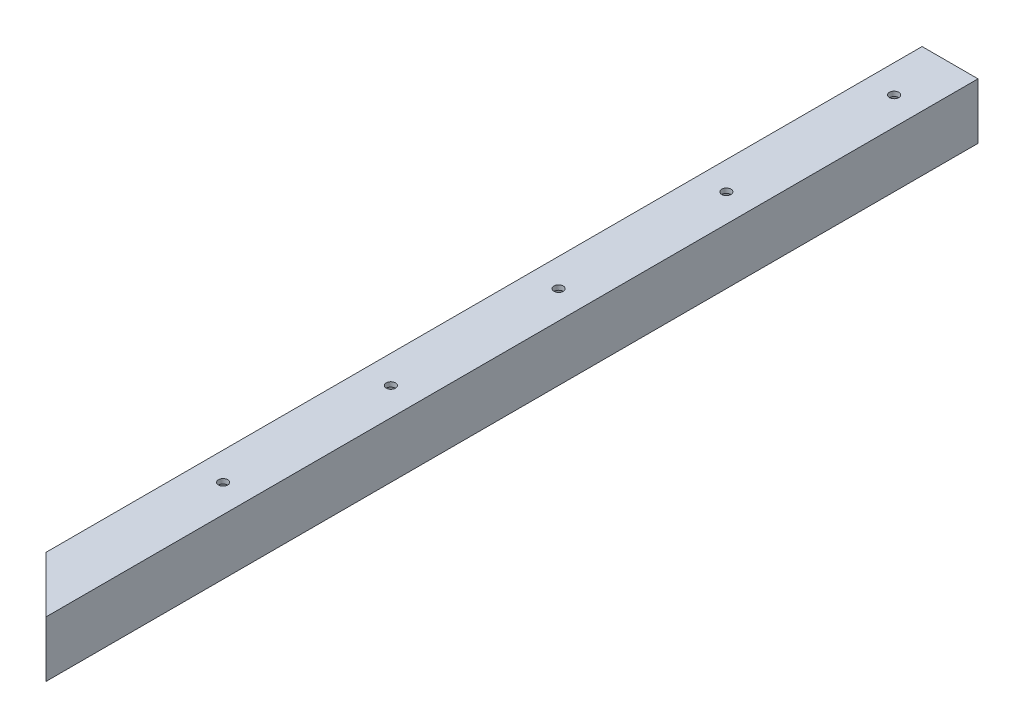
ISO-10303-21;
HEADER;
FILE_DESCRIPTION(('STEP AP214'),'2;1');
FILE_NAME('part.step','',(''),(''),'','','');
FILE_SCHEMA(('AUTOMOTIVE_DESIGN { 1 0 10303 214 1 1 1 1 }'));
ENDSEC;
DATA;
#1=APPLICATION_CONTEXT('core data for automotive mechanical design processes');
#2=APPLICATION_PROTOCOL_DEFINITION('international standard','automotive_design',2000,#1);
#3=PRODUCT_CONTEXT('',#1,'mechanical');
#4=PRODUCT('Part','Part','',(#3));
#5=PRODUCT_RELATED_PRODUCT_CATEGORY('part','',(#4));
#6=PRODUCT_DEFINITION_FORMATION('','',#4);
#7=PRODUCT_DEFINITION_CONTEXT('part definition',#1,'design');
#8=PRODUCT_DEFINITION('design','',#6,#7);
#9=PRODUCT_DEFINITION_SHAPE('','',#8);
#10=(LENGTH_UNIT() NAMED_UNIT(*) SI_UNIT(.MILLI.,.METRE.));
#11=(NAMED_UNIT(*) PLANE_ANGLE_UNIT() SI_UNIT($,.RADIAN.));
#12=(NAMED_UNIT(*) SI_UNIT($,.STERADIAN.) SOLID_ANGLE_UNIT());
#13=UNCERTAINTY_MEASURE_WITH_UNIT(LENGTH_MEASURE(1.E-05),#10,'distance_accuracy_value','');
#14=(GEOMETRIC_REPRESENTATION_CONTEXT(3) GLOBAL_UNCERTAINTY_ASSIGNED_CONTEXT((#13)) GLOBAL_UNIT_ASSIGNED_CONTEXT((#10,
#11,#12)) REPRESENTATION_CONTEXT('',''));
#15=CARTESIAN_POINT('',(0.,0.,0.));
#16=DIRECTION('',(0.,0.,1.));
#17=DIRECTION('',(1.,0.,0.));
#18=AXIS2_PLACEMENT_3D('',#15,#16,#17);
#19=CARTESIAN_POINT('',(19.05,-0.00100000000000211,368.3));
#20=DIRECTION('',(0.707106781176342,0.,-0.707106781196753));
#21=DIRECTION('',(-0.707106781196753,0.,-0.707106781176342));
#22=AXIS2_PLACEMENT_3D('',#19,#20,#21);
#23=PLANE('',#22);
#24=DIRECTION('',(0.,-1.,0.));
#25=VECTOR('',#24,1.);
#26=CARTESIAN_POINT('',(19.05,-0.000500000000001055,368.3));
#27=LINE('',#26,#25);
#28=CARTESIAN_POINT('',(19.05,38.1,368.3));
#29=VERTEX_POINT('',#28);
#30=CARTESIAN_POINT('',(19.05,0.,368.3));
#31=VERTEX_POINT('',#30);
#32=EDGE_CURVE('E51',#29,#31,#27,.T.);
#33=ORIENTED_EDGE('',*,*,#32,.F.);
#34=DIRECTION('',(0.707106781196753,0.,0.707106781176342));
#35=VECTOR('',#34,1.);
#36=CARTESIAN_POINT('',(-77.7875000001375,38.1,271.462500002658));
#37=LINE('',#36,#35);
#38=CARTESIAN_POINT('',(-19.05,38.1,330.2000000011));
#39=VERTEX_POINT('',#38);
#40=EDGE_CURVE('E170',#39,#29,#37,.T.);
#41=ORIENTED_EDGE('',*,*,#40,.F.);
#42=DIRECTION('',(0.,1.,0.));
#43=VECTOR('',#42,1.);
#44=CARTESIAN_POINT('',(-19.05,-0.000500000000001055,330.2000000011));
#45=LINE('',#44,#43);
#46=CARTESIAN_POINT('',(-19.05,0.,330.2000000011));
#47=VERTEX_POINT('',#46);
#48=EDGE_CURVE('E11',#47,#39,#45,.T.);
#49=ORIENTED_EDGE('',*,*,#48,.F.);
#50=DIRECTION('',(-0.707106781196753,0.,-0.707106781176342));
#51=VECTOR('',#50,1.);
#52=CARTESIAN_POINT('',(-77.7875000001375,0.,271.462500002658));
#53=LINE('',#52,#51);
#54=EDGE_CURVE('E104',#31,#47,#53,.T.);
#55=ORIENTED_EDGE('',*,*,#54,.F.);
#56=EDGE_LOOP('',(#33,#41,#49,#55));
#57=FACE_BOUND('',#56,.T.);
#58=DIRECTION('',(0.707106781196753,0.,0.707106781176342));
#59=VECTOR('',#58,1.);
#60=CARTESIAN_POINT('',(-77.7875000001375,3.175,271.462500002658));
#61=LINE('',#60,#59);
#62=CARTESIAN_POINT('',(-15.875,3.175,333.375000001008));
#63=VERTEX_POINT('',#62);
#64=CARTESIAN_POINT('',(15.875,3.175,365.125000000092));
#65=VERTEX_POINT('',#64);
#66=EDGE_CURVE('E126',#63,#65,#61,.T.);
#67=ORIENTED_EDGE('',*,*,#66,.F.);
#68=DIRECTION('',(0.,-1.,0.));
#69=VECTOR('',#68,1.);
#70=CARTESIAN_POINT('',(-15.875,-0.000500000000001055,333.375000001008));
#71=LINE('',#70,#69);
#72=CARTESIAN_POINT('',(-15.875,34.925,333.375000001008));
#73=VERTEX_POINT('',#72);
#74=EDGE_CURVE('E73',#73,#63,#71,.T.);
#75=ORIENTED_EDGE('',*,*,#74,.F.);
#76=DIRECTION('',(-0.707106781196753,0.,-0.707106781176342));
#77=VECTOR('',#76,1.);
#78=CARTESIAN_POINT('',(-77.7875000001375,34.925,271.462500002658));
#79=LINE('',#78,#77);
#80=CARTESIAN_POINT('',(15.875,34.925,365.125000000092));
#81=VERTEX_POINT('',#80);
#82=EDGE_CURVE('E91',#81,#73,#79,.T.);
#83=ORIENTED_EDGE('',*,*,#82,.F.);
#84=DIRECTION('',(0.,1.,0.));
#85=VECTOR('',#84,1.);
#86=CARTESIAN_POINT('',(15.875,-0.000500000000001055,365.125000000092));
#87=LINE('',#86,#85);
#88=EDGE_CURVE('E79',#65,#81,#87,.T.);
#89=ORIENTED_EDGE('',*,*,#88,.F.);
#90=EDGE_LOOP('',(#67,#75,#83,#89));
#91=FACE_BOUND('',#90,.T.);
#92=ADVANCED_FACE('F32',(#57,#91),#23,.F.);
#93=CARTESIAN_POINT('',(-19.05,0.,-241.3));
#94=DIRECTION('',(-1.,0.,0.));
#95=DIRECTION('',(0.,0.,1.));
#96=AXIS2_PLACEMENT_3D('',#93,#94,#95);
#97=PLANE('',#96);
#98=ORIENTED_EDGE('',*,*,#48,.T.);
#99=DIRECTION('',(0.,0.,1.));
#100=VECTOR('',#99,1.);
#101=CARTESIAN_POINT('',(-19.05,38.1,241.3));
#102=LINE('',#101,#100);
#103=CARTESIAN_POINT('',(-19.05,38.1,-266.7));
#104=VERTEX_POINT('',#103);
#105=EDGE_CURVE('E95',#104,#39,#102,.T.);
#106=ORIENTED_EDGE('',*,*,#105,.F.);
#107=DIRECTION('',(0.,1.,0.));
#108=VECTOR('',#107,1.);
#109=CARTESIAN_POINT('',(-19.05,0.,-266.7));
#110=LINE('',#109,#108);
#111=CARTESIAN_POINT('',(-19.05,0.,-266.7));
#112=VERTEX_POINT('',#111);
#113=EDGE_CURVE('E383',#112,#104,#110,.T.);
#114=ORIENTED_EDGE('',*,*,#113,.F.);
#115=DIRECTION('',(0.,0.,-1.));
#116=VECTOR('',#115,1.);
#117=CARTESIAN_POINT('',(-19.05,0.,241.3));
#118=LINE('',#117,#116);
#119=EDGE_CURVE('E145',#47,#112,#118,.T.);
#120=ORIENTED_EDGE('',*,*,#119,.F.);
#121=EDGE_LOOP('',(#98,#106,#114,#120));
#122=FACE_BOUND('',#121,.T.);
#123=ADVANCED_FACE('F215',(#122),#97,.T.);
#124=CARTESIAN_POINT('',(0.,38.1,0.));
#125=DIRECTION('',(0.,1.,0.));
#126=DIRECTION('',(0.,0.,1.));
#127=AXIS2_PLACEMENT_3D('',#124,#125,#126);
#128=PLANE('',#127);
#129=CARTESIAN_POINT('',(0.,38.1,-228.6));
#130=DIRECTION('',(0.,-1.,0.));
#131=DIRECTION('',(0.,0.,-1.));
#132=AXIS2_PLACEMENT_3D('',#129,#130,#131);
#133=CIRCLE('',#132,3.175);
#134=CARTESIAN_POINT('',(0.,38.1,-231.775));
#135=VERTEX_POINT('',#134);
#136=EDGE_CURVE('E42',#135,#135,#133,.T.);
#137=ORIENTED_EDGE('',*,*,#136,.T.);
#138=EDGE_LOOP('',(#137));
#139=FACE_BOUND('',#138,.T.);
#140=CARTESIAN_POINT('',(0.,38.1,-114.3));
#141=DIRECTION('',(0.,-1.,0.));
#142=DIRECTION('',(0.,0.,-1.));
#143=AXIS2_PLACEMENT_3D('',#140,#141,#142);
#144=CIRCLE('',#143,3.175);
#145=CARTESIAN_POINT('',(0.,38.1,-117.475));
#146=VERTEX_POINT('',#145);
#147=EDGE_CURVE('E182',#146,#146,#144,.T.);
#148=ORIENTED_EDGE('',*,*,#147,.T.);
#149=EDGE_LOOP('',(#148));
#150=FACE_BOUND('',#149,.T.);
#151=CARTESIAN_POINT('',(0.,38.1,0.));
#152=DIRECTION('',(0.,-1.,0.));
#153=DIRECTION('',(0.,0.,-1.));
#154=AXIS2_PLACEMENT_3D('',#151,#152,#153);
#155=CIRCLE('',#154,3.175);
#156=CARTESIAN_POINT('',(0.,38.1,-3.175));
#157=VERTEX_POINT('',#156);
#158=EDGE_CURVE('E185',#157,#157,#155,.T.);
#159=ORIENTED_EDGE('',*,*,#158,.T.);
#160=EDGE_LOOP('',(#159));
#161=FACE_BOUND('',#160,.T.);
#162=CARTESIAN_POINT('',(0.,38.1,114.3));
#163=DIRECTION('',(0.,-1.,0.));
#164=DIRECTION('',(0.,0.,-1.));
#165=AXIS2_PLACEMENT_3D('',#162,#163,#164);
#166=CIRCLE('',#165,3.175);
#167=CARTESIAN_POINT('',(0.,38.1,111.125));
#168=VERTEX_POINT('',#167);
#169=EDGE_CURVE('E188',#168,#168,#166,.T.);
#170=ORIENTED_EDGE('',*,*,#169,.T.);
#171=EDGE_LOOP('',(#170));
#172=FACE_BOUND('',#171,.T.);
#173=CARTESIAN_POINT('',(0.,38.1,228.6));
#174=DIRECTION('',(0.,-1.,0.));
#175=DIRECTION('',(0.,0.,-1.));
#176=AXIS2_PLACEMENT_3D('',#173,#174,#175);
#177=CIRCLE('',#176,3.175);
#178=CARTESIAN_POINT('',(0.,38.1,225.425));
#179=VERTEX_POINT('',#178);
#180=EDGE_CURVE('E171',#179,#179,#177,.T.);
#181=ORIENTED_EDGE('',*,*,#180,.T.);
#182=EDGE_LOOP('',(#181));
#183=FACE_BOUND('',#182,.T.);
#184=ORIENTED_EDGE('',*,*,#40,.T.);
#185=DIRECTION('',(0.,0.,1.));
#186=VECTOR('',#185,1.);
#187=CARTESIAN_POINT('',(19.05,38.1,241.3));
#188=LINE('',#187,#186);
#189=CARTESIAN_POINT('',(19.05,38.1,-266.7));
#190=VERTEX_POINT('',#189);
#191=EDGE_CURVE('E161',#190,#29,#188,.T.);
#192=ORIENTED_EDGE('',*,*,#191,.F.);
#193=DIRECTION('',(1.,0.,0.));
#194=VECTOR('',#193,1.);
#195=CARTESIAN_POINT('',(-19.05,38.1,-266.7));
#196=LINE('',#195,#194);
#197=EDGE_CURVE('E166',#104,#190,#196,.T.);
#198=ORIENTED_EDGE('',*,*,#197,.F.);
#199=ORIENTED_EDGE('',*,*,#105,.T.);
#200=EDGE_LOOP('',(#184,#192,#198,#199));
#201=FACE_BOUND('',#200,.T.);
#202=ADVANCED_FACE('F194',(#139,#150,#161,#172,#183,#201),#128,.T.);
#203=CARTESIAN_POINT('',(0.,34.925,0.));
#204=DIRECTION('',(0.,1.,0.));
#205=DIRECTION('',(0.,0.,1.));
#206=AXIS2_PLACEMENT_3D('',#203,#204,#205);
#207=PLANE('',#206);
#208=ORIENTED_EDGE('',*,*,#82,.T.);
#209=DIRECTION('',(0.,0.,1.));
#210=VECTOR('',#209,1.);
#211=CARTESIAN_POINT('',(-15.875,34.925,-120.65));
#212=LINE('',#211,#210);
#213=CARTESIAN_POINT('',(-15.875,34.925,-266.7));
#214=VERTEX_POINT('',#213);
#215=EDGE_CURVE('E108',#214,#73,#212,.T.);
#216=ORIENTED_EDGE('',*,*,#215,.F.);
#217=DIRECTION('',(1.,0.,0.));
#218=VECTOR('',#217,1.);
#219=CARTESIAN_POINT('',(15.875,34.925,-266.7));
#220=LINE('',#219,#218);
#221=CARTESIAN_POINT('',(15.875,34.925,-266.7));
#222=VERTEX_POINT('',#221);
#223=EDGE_CURVE('E101',#214,#222,#220,.T.);
#224=ORIENTED_EDGE('',*,*,#223,.T.);
#225=DIRECTION('',(0.,0.,-1.));
#226=VECTOR('',#225,1.);
#227=CARTESIAN_POINT('',(15.875,34.925,120.65));
#228=LINE('',#227,#226);
#229=EDGE_CURVE('E84',#81,#222,#228,.T.);
#230=ORIENTED_EDGE('',*,*,#229,.F.);
#231=EDGE_LOOP('',(#208,#216,#224,#230));
#232=FACE_BOUND('',#231,.T.);
#233=CARTESIAN_POINT('',(0.,34.925,228.6));
#234=DIRECTION('',(0.,1.,0.));
#235=DIRECTION('',(1.,0.,0.));
#236=AXIS2_PLACEMENT_3D('',#233,#234,#235);
#237=CIRCLE('',#236,3.175);
#238=CARTESIAN_POINT('',(3.175,34.925,228.6));
#239=VERTEX_POINT('',#238);
#240=EDGE_CURVE('E96',#239,#239,#237,.T.);
#241=ORIENTED_EDGE('',*,*,#240,.T.);
#242=EDGE_LOOP('',(#241));
#243=FACE_BOUND('',#242,.T.);
#244=CARTESIAN_POINT('',(0.,34.925,114.3));
#245=DIRECTION('',(0.,1.,0.));
#246=DIRECTION('',(1.,0.,0.));
#247=AXIS2_PLACEMENT_3D('',#244,#245,#246);
#248=CIRCLE('',#247,3.175);
#249=CARTESIAN_POINT('',(3.175,34.925,114.3));
#250=VERTEX_POINT('',#249);
#251=EDGE_CURVE('E112',#250,#250,#248,.T.);
#252=ORIENTED_EDGE('',*,*,#251,.T.);
#253=EDGE_LOOP('',(#252));
#254=FACE_BOUND('',#253,.T.);
#255=CARTESIAN_POINT('',(0.,34.925,0.));
#256=DIRECTION('',(0.,1.,0.));
#257=DIRECTION('',(1.,0.,0.));
#258=AXIS2_PLACEMENT_3D('',#255,#256,#257);
#259=CIRCLE('',#258,3.175);
#260=CARTESIAN_POINT('',(3.175,34.925,0.));
#261=VERTEX_POINT('',#260);
#262=EDGE_CURVE('E115',#261,#261,#259,.T.);
#263=ORIENTED_EDGE('',*,*,#262,.T.);
#264=EDGE_LOOP('',(#263));
#265=FACE_BOUND('',#264,.T.);
#266=CARTESIAN_POINT('',(0.,34.925,-114.3));
#267=DIRECTION('',(0.,1.,0.));
#268=DIRECTION('',(1.,0.,0.));
#269=AXIS2_PLACEMENT_3D('',#266,#267,#268);
#270=CIRCLE('',#269,3.175);
#271=CARTESIAN_POINT('',(3.175,34.925,-114.3));
#272=VERTEX_POINT('',#271);
#273=EDGE_CURVE('E118',#272,#272,#270,.T.);
#274=ORIENTED_EDGE('',*,*,#273,.T.);
#275=EDGE_LOOP('',(#274));
#276=FACE_BOUND('',#275,.T.);
#277=CARTESIAN_POINT('',(0.,34.925,-228.6));
#278=DIRECTION('',(0.,1.,0.));
#279=DIRECTION('',(1.,0.,0.));
#280=AXIS2_PLACEMENT_3D('',#277,#278,#279);
#281=CIRCLE('',#280,3.175);
#282=CARTESIAN_POINT('',(3.175,34.925,-228.6));
#283=VERTEX_POINT('',#282);
#284=EDGE_CURVE('E121',#283,#283,#281,.T.);
#285=ORIENTED_EDGE('',*,*,#284,.T.);
#286=EDGE_LOOP('',(#285));
#287=FACE_BOUND('',#286,.T.);
#288=ADVANCED_FACE('F98',(#232,#243,#254,#265,#276,#287),#207,.F.);
#289=CARTESIAN_POINT('',(-15.875,0.,-241.3));
#290=DIRECTION('',(-1.,0.,0.));
#291=DIRECTION('',(0.,0.,1.));
#292=AXIS2_PLACEMENT_3D('',#289,#290,#291);
#293=PLANE('',#292);
#294=ORIENTED_EDGE('',*,*,#74,.T.);
#295=DIRECTION('',(0.,0.,1.));
#296=VECTOR('',#295,1.);
#297=CARTESIAN_POINT('',(-15.875,3.175,241.3));
#298=LINE('',#297,#296);
#299=CARTESIAN_POINT('',(-15.875,3.175,-266.7));
#300=VERTEX_POINT('',#299);
#301=EDGE_CURVE('E124',#300,#63,#298,.T.);
#302=ORIENTED_EDGE('',*,*,#301,.F.);
#303=DIRECTION('',(0.,1.,0.));
#304=VECTOR('',#303,1.);
#305=CARTESIAN_POINT('',(-15.875,34.925,-266.7));
#306=LINE('',#305,#304);
#307=EDGE_CURVE('E371',#300,#214,#306,.T.);
#308=ORIENTED_EDGE('',*,*,#307,.T.);
#309=ORIENTED_EDGE('',*,*,#215,.T.);
#310=EDGE_LOOP('',(#294,#302,#308,#309));
#311=FACE_BOUND('',#310,.T.);
#312=ADVANCED_FACE('F230',(#311),#293,.F.);
#313=CARTESIAN_POINT('',(0.,3.175,0.));
#314=DIRECTION('',(0.,1.,0.));
#315=DIRECTION('',(0.,0.,1.));
#316=AXIS2_PLACEMENT_3D('',#313,#314,#315);
#317=PLANE('',#316);
#318=ORIENTED_EDGE('',*,*,#66,.T.);
#319=DIRECTION('',(0.,0.,1.));
#320=VECTOR('',#319,1.);
#321=CARTESIAN_POINT('',(15.875,3.175,120.65));
#322=LINE('',#321,#320);
#323=CARTESIAN_POINT('',(15.875,3.175,-266.7));
#324=VERTEX_POINT('',#323);
#325=EDGE_CURVE('E87',#324,#65,#322,.T.);
#326=ORIENTED_EDGE('',*,*,#325,.F.);
#327=DIRECTION('',(-1.,0.,0.));
#328=VECTOR('',#327,1.);
#329=CARTESIAN_POINT('',(-15.875,3.175,-266.7));
#330=LINE('',#329,#328);
#331=EDGE_CURVE('E375',#324,#300,#330,.T.);
#332=ORIENTED_EDGE('',*,*,#331,.T.);
#333=ORIENTED_EDGE('',*,*,#301,.T.);
#334=EDGE_LOOP('',(#318,#326,#332,#333));
#335=FACE_BOUND('',#334,.T.);
#336=CARTESIAN_POINT('',(0.,3.17500000000003,228.6));
#337=DIRECTION('',(0.,-1.,0.));
#338=DIRECTION('',(0.,0.,-1.));
#339=AXIS2_PLACEMENT_3D('',#336,#337,#338);
#340=CIRCLE('',#339,3.175);
#341=CARTESIAN_POINT('',(0.,3.17500000000003,225.425));
#342=VERTEX_POINT('',#341);
#343=EDGE_CURVE('E127',#342,#342,#340,.T.);
#344=ORIENTED_EDGE('',*,*,#343,.T.);
#345=EDGE_LOOP('',(#344));
#346=FACE_BOUND('',#345,.T.);
#347=CARTESIAN_POINT('',(0.,3.17500000000003,114.3));
#348=DIRECTION('',(0.,-1.,0.));
#349=DIRECTION('',(0.,0.,-1.));
#350=AXIS2_PLACEMENT_3D('',#347,#348,#349);
#351=CIRCLE('',#350,3.175);
#352=CARTESIAN_POINT('',(0.,3.17500000000003,111.125));
#353=VERTEX_POINT('',#352);
#354=EDGE_CURVE('E131',#353,#353,#351,.T.);
#355=ORIENTED_EDGE('',*,*,#354,.T.);
#356=EDGE_LOOP('',(#355));
#357=FACE_BOUND('',#356,.T.);
#358=CARTESIAN_POINT('',(0.,3.17500000000003,0.));
#359=DIRECTION('',(0.,-1.,0.));
#360=DIRECTION('',(0.,0.,-1.));
#361=AXIS2_PLACEMENT_3D('',#358,#359,#360);
#362=CIRCLE('',#361,3.175);
#363=CARTESIAN_POINT('',(0.,3.17500000000003,-3.175));
#364=VERTEX_POINT('',#363);
#365=EDGE_CURVE('E134',#364,#364,#362,.T.);
#366=ORIENTED_EDGE('',*,*,#365,.T.);
#367=EDGE_LOOP('',(#366));
#368=FACE_BOUND('',#367,.T.);
#369=CARTESIAN_POINT('',(0.,3.17500000000003,-114.3));
#370=DIRECTION('',(0.,-1.,0.));
#371=DIRECTION('',(0.,0.,-1.));
#372=AXIS2_PLACEMENT_3D('',#369,#370,#371);
#373=CIRCLE('',#372,3.175);
#374=CARTESIAN_POINT('',(0.,3.17500000000003,-117.475));
#375=VERTEX_POINT('',#374);
#376=EDGE_CURVE('E137',#375,#375,#373,.T.);
#377=ORIENTED_EDGE('',*,*,#376,.T.);
#378=EDGE_LOOP('',(#377));
#379=FACE_BOUND('',#378,.T.);
#380=CARTESIAN_POINT('',(0.,3.17500000000003,-228.6));
#381=DIRECTION('',(0.,-1.,0.));
#382=DIRECTION('',(0.,0.,-1.));
#383=AXIS2_PLACEMENT_3D('',#380,#381,#382);
#384=CIRCLE('',#383,3.175);
#385=CARTESIAN_POINT('',(0.,3.17500000000003,-231.775));
#386=VERTEX_POINT('',#385);
#387=EDGE_CURVE('E89',#386,#386,#384,.T.);
#388=ORIENTED_EDGE('',*,*,#387,.T.);
#389=EDGE_LOOP('',(#388));
#390=FACE_BOUND('',#389,.T.);
#391=ADVANCED_FACE('F233',(#335,#346,#357,#368,#379,#390),#317,.T.);
#392=CARTESIAN_POINT('',(15.875,0.,241.3));
#393=DIRECTION('',(1.,0.,0.));
#394=DIRECTION('',(0.,0.,-1.));
#395=AXIS2_PLACEMENT_3D('',#392,#393,#394);
#396=PLANE('',#395);
#397=ORIENTED_EDGE('',*,*,#88,.T.);
#398=ORIENTED_EDGE('',*,*,#229,.T.);
#399=DIRECTION('',(0.,-1.,0.));
#400=VECTOR('',#399,1.);
#401=CARTESIAN_POINT('',(15.875,3.175,-266.7));
#402=LINE('',#401,#400);
#403=EDGE_CURVE('E372',#222,#324,#402,.T.);
#404=ORIENTED_EDGE('',*,*,#403,.T.);
#405=ORIENTED_EDGE('',*,*,#325,.T.);
#406=EDGE_LOOP('',(#397,#398,#404,#405));
#407=FACE_BOUND('',#406,.T.);
#408=ADVANCED_FACE('F80',(#407),#396,.F.);
#409=CARTESIAN_POINT('',(0.,0.,0.));
#410=DIRECTION('',(0.,1.,0.));
#411=DIRECTION('',(0.,0.,1.));
#412=AXIS2_PLACEMENT_3D('',#409,#410,#411);
#413=PLANE('',#412);
#414=ORIENTED_EDGE('',*,*,#54,.T.);
#415=ORIENTED_EDGE('',*,*,#119,.T.);
#416=DIRECTION('',(-1.,0.,0.));
#417=VECTOR('',#416,1.);
#418=CARTESIAN_POINT('',(19.05,0.,-266.7));
#419=LINE('',#418,#417);
#420=CARTESIAN_POINT('',(19.05,0.,-266.7));
#421=VERTEX_POINT('',#420);
#422=EDGE_CURVE('E382',#421,#112,#419,.T.);
#423=ORIENTED_EDGE('',*,*,#422,.F.);
#424=DIRECTION('',(0.,0.,1.));
#425=VECTOR('',#424,1.);
#426=CARTESIAN_POINT('',(19.05,0.,241.3));
#427=LINE('',#426,#425);
#428=EDGE_CURVE('E142',#421,#31,#427,.T.);
#429=ORIENTED_EDGE('',*,*,#428,.T.);
#430=EDGE_LOOP('',(#414,#415,#423,#429));
#431=FACE_BOUND('',#430,.T.);
#432=CARTESIAN_POINT('',(0.,0.,-228.6));
#433=DIRECTION('',(0.,1.,0.));
#434=DIRECTION('',(1.,0.,0.));
#435=AXIS2_PLACEMENT_3D('',#432,#433,#434);
#436=CIRCLE('',#435,3.175);
#437=CARTESIAN_POINT('',(3.175,0.,-228.6));
#438=VERTEX_POINT('',#437);
#439=EDGE_CURVE('E146',#438,#438,#436,.T.);
#440=ORIENTED_EDGE('',*,*,#439,.T.);
#441=EDGE_LOOP('',(#440));
#442=FACE_BOUND('',#441,.T.);
#443=CARTESIAN_POINT('',(0.,0.,-114.3));
#444=DIRECTION('',(0.,1.,0.));
#445=DIRECTION('',(1.,0.,0.));
#446=AXIS2_PLACEMENT_3D('',#443,#444,#445);
#447=CIRCLE('',#446,3.175);
#448=CARTESIAN_POINT('',(3.175,0.,-114.3));
#449=VERTEX_POINT('',#448);
#450=EDGE_CURVE('E149',#449,#449,#447,.T.);
#451=ORIENTED_EDGE('',*,*,#450,.T.);
#452=EDGE_LOOP('',(#451));
#453=FACE_BOUND('',#452,.T.);
#454=CARTESIAN_POINT('',(0.,0.,0.));
#455=DIRECTION('',(0.,1.,0.));
#456=DIRECTION('',(1.,0.,0.));
#457=AXIS2_PLACEMENT_3D('',#454,#455,#456);
#458=CIRCLE('',#457,3.175);
#459=CARTESIAN_POINT('',(3.175,0.,0.));
#460=VERTEX_POINT('',#459);
#461=EDGE_CURVE('E152',#460,#460,#458,.T.);
#462=ORIENTED_EDGE('',*,*,#461,.T.);
#463=EDGE_LOOP('',(#462));
#464=FACE_BOUND('',#463,.T.);
#465=CARTESIAN_POINT('',(0.,0.,114.3));
#466=DIRECTION('',(0.,1.,0.));
#467=DIRECTION('',(1.,0.,0.));
#468=AXIS2_PLACEMENT_3D('',#465,#466,#467);
#469=CIRCLE('',#468,3.175);
#470=CARTESIAN_POINT('',(3.175,0.,114.3));
#471=VERTEX_POINT('',#470);
#472=EDGE_CURVE('E154',#471,#471,#469,.T.);
#473=ORIENTED_EDGE('',*,*,#472,.T.);
#474=EDGE_LOOP('',(#473));
#475=FACE_BOUND('',#474,.T.);
#476=CARTESIAN_POINT('',(0.,0.,228.6));
#477=DIRECTION('',(0.,1.,0.));
#478=DIRECTION('',(1.,0.,0.));
#479=AXIS2_PLACEMENT_3D('',#476,#477,#478);
#480=CIRCLE('',#479,3.175);
#481=CARTESIAN_POINT('',(3.175,0.,228.6));
#482=VERTEX_POINT('',#481);
#483=EDGE_CURVE('E36',#482,#482,#480,.T.);
#484=ORIENTED_EDGE('',*,*,#483,.T.);
#485=EDGE_LOOP('',(#484));
#486=FACE_BOUND('',#485,.T.);
#487=ADVANCED_FACE('F210',(#431,#442,#453,#464,#475,#486),#413,.F.);
#488=CARTESIAN_POINT('',(0.,-447.498579075351,228.6));
#489=DIRECTION('',(0.,1.,0.));
#490=DIRECTION('',(1.,0.,0.));
#491=AXIS2_PLACEMENT_3D('',#488,#489,#490);
#492=CYLINDRICAL_SURFACE('',#491,3.175);
#493=ORIENTED_EDGE('',*,*,#483,.F.);
#494=EDGE_LOOP('',(#493));
#495=FACE_BOUND('',#494,.T.);
#496=ORIENTED_EDGE('',*,*,#343,.F.);
#497=EDGE_LOOP('',(#496));
#498=FACE_BOUND('',#497,.T.);
#499=ADVANCED_FACE('F200',(#495,#498),#492,.F.);
#500=CARTESIAN_POINT('',(0.,-447.498579075351,228.6));
#501=DIRECTION('',(0.,1.,0.));
#502=DIRECTION('',(1.,0.,0.));
#503=AXIS2_PLACEMENT_3D('',#500,#501,#502);
#504=CYLINDRICAL_SURFACE('',#503,3.175);
#505=ORIENTED_EDGE('',*,*,#240,.F.);
#506=EDGE_LOOP('',(#505));
#507=FACE_BOUND('',#506,.T.);
#508=ORIENTED_EDGE('',*,*,#180,.F.);
#509=EDGE_LOOP('',(#508));
#510=FACE_BOUND('',#509,.T.);
#511=ADVANCED_FACE('F197',(#507,#510),#504,.F.);
#512=CARTESIAN_POINT('',(0.,-447.498579075351,114.3));
#513=DIRECTION('',(0.,1.,0.));
#514=DIRECTION('',(1.,0.,0.));
#515=AXIS2_PLACEMENT_3D('',#512,#513,#514);
#516=CYLINDRICAL_SURFACE('',#515,3.175);
#517=ORIENTED_EDGE('',*,*,#472,.F.);
#518=EDGE_LOOP('',(#517));
#519=FACE_BOUND('',#518,.T.);
#520=ORIENTED_EDGE('',*,*,#354,.F.);
#521=EDGE_LOOP('',(#520));
#522=FACE_BOUND('',#521,.T.);
#523=ADVANCED_FACE('F199',(#519,#522),#516,.F.);
#524=CARTESIAN_POINT('',(0.,-447.498579075351,114.3));
#525=DIRECTION('',(0.,1.,0.));
#526=DIRECTION('',(1.,0.,0.));
#527=AXIS2_PLACEMENT_3D('',#524,#525,#526);
#528=CYLINDRICAL_SURFACE('',#527,3.175);
#529=ORIENTED_EDGE('',*,*,#251,.F.);
#530=EDGE_LOOP('',(#529));
#531=FACE_BOUND('',#530,.T.);
#532=ORIENTED_EDGE('',*,*,#169,.F.);
#533=EDGE_LOOP('',(#532));
#534=FACE_BOUND('',#533,.T.);
#535=ADVANCED_FACE('F207',(#531,#534),#528,.F.);
#536=CARTESIAN_POINT('',(0.,-447.498579075351,0.));
#537=DIRECTION('',(0.,1.,0.));
#538=DIRECTION('',(1.,0.,0.));
#539=AXIS2_PLACEMENT_3D('',#536,#537,#538);
#540=CYLINDRICAL_SURFACE('',#539,3.175);
#541=ORIENTED_EDGE('',*,*,#461,.F.);
#542=EDGE_LOOP('',(#541));
#543=FACE_BOUND('',#542,.T.);
#544=ORIENTED_EDGE('',*,*,#365,.F.);
#545=EDGE_LOOP('',(#544));
#546=FACE_BOUND('',#545,.T.);
#547=ADVANCED_FACE('F252',(#543,#546),#540,.F.);
#548=CARTESIAN_POINT('',(0.,-447.498579075351,0.));
#549=DIRECTION('',(0.,1.,0.));
#550=DIRECTION('',(1.,0.,0.));
#551=AXIS2_PLACEMENT_3D('',#548,#549,#550);
#552=CYLINDRICAL_SURFACE('',#551,3.175);
#553=ORIENTED_EDGE('',*,*,#262,.F.);
#554=EDGE_LOOP('',(#553));
#555=FACE_BOUND('',#554,.T.);
#556=ORIENTED_EDGE('',*,*,#158,.F.);
#557=EDGE_LOOP('',(#556));
#558=FACE_BOUND('',#557,.T.);
#559=ADVANCED_FACE('F255',(#555,#558),#552,.F.);
#560=CARTESIAN_POINT('',(0.,-447.498579075351,-114.3));
#561=DIRECTION('',(0.,1.,0.));
#562=DIRECTION('',(1.,0.,0.));
#563=AXIS2_PLACEMENT_3D('',#560,#561,#562);
#564=CYLINDRICAL_SURFACE('',#563,3.175);
#565=ORIENTED_EDGE('',*,*,#450,.F.);
#566=EDGE_LOOP('',(#565));
#567=FACE_BOUND('',#566,.T.);
#568=ORIENTED_EDGE('',*,*,#376,.F.);
#569=EDGE_LOOP('',(#568));
#570=FACE_BOUND('',#569,.T.);
#571=ADVANCED_FACE('F275',(#567,#570),#564,.F.);
#572=CARTESIAN_POINT('',(0.,-447.498579075351,-114.3));
#573=DIRECTION('',(0.,1.,0.));
#574=DIRECTION('',(1.,0.,0.));
#575=AXIS2_PLACEMENT_3D('',#572,#573,#574);
#576=CYLINDRICAL_SURFACE('',#575,3.175);
#577=ORIENTED_EDGE('',*,*,#273,.F.);
#578=EDGE_LOOP('',(#577));
#579=FACE_BOUND('',#578,.T.);
#580=ORIENTED_EDGE('',*,*,#147,.F.);
#581=EDGE_LOOP('',(#580));
#582=FACE_BOUND('',#581,.T.);
#583=ADVANCED_FACE('F267',(#579,#582),#576,.F.);
#584=CARTESIAN_POINT('',(0.,-447.498579075351,-228.6));
#585=DIRECTION('',(0.,1.,0.));
#586=DIRECTION('',(1.,0.,0.));
#587=AXIS2_PLACEMENT_3D('',#584,#585,#586);
#588=CYLINDRICAL_SURFACE('',#587,3.175);
#589=ORIENTED_EDGE('',*,*,#439,.F.);
#590=EDGE_LOOP('',(#589));
#591=FACE_BOUND('',#590,.T.);
#592=ORIENTED_EDGE('',*,*,#387,.F.);
#593=EDGE_LOOP('',(#592));
#594=FACE_BOUND('',#593,.T.);
#595=ADVANCED_FACE('F264',(#591,#594),#588,.F.);
#596=CARTESIAN_POINT('',(0.,-447.498579075351,-228.6));
#597=DIRECTION('',(0.,1.,0.));
#598=DIRECTION('',(1.,0.,0.));
#599=AXIS2_PLACEMENT_3D('',#596,#597,#598);
#600=CYLINDRICAL_SURFACE('',#599,3.175);
#601=ORIENTED_EDGE('',*,*,#284,.F.);
#602=EDGE_LOOP('',(#601));
#603=FACE_BOUND('',#602,.T.);
#604=ORIENTED_EDGE('',*,*,#136,.F.);
#605=EDGE_LOOP('',(#604));
#606=FACE_BOUND('',#605,.T.);
#607=ADVANCED_FACE('F266',(#603,#606),#600,.F.);
#608=CARTESIAN_POINT('',(19.05,0.,241.3));
#609=DIRECTION('',(1.,0.,0.));
#610=DIRECTION('',(0.,0.,-1.));
#611=AXIS2_PLACEMENT_3D('',#608,#609,#610);
#612=PLANE('',#611);
#613=ORIENTED_EDGE('',*,*,#32,.T.);
#614=ORIENTED_EDGE('',*,*,#428,.F.);
#615=DIRECTION('',(0.,-1.,0.));
#616=VECTOR('',#615,1.);
#617=CARTESIAN_POINT('',(19.05,38.1,-266.7));
#618=LINE('',#617,#616);
#619=EDGE_CURVE('E365',#190,#421,#618,.T.);
#620=ORIENTED_EDGE('',*,*,#619,.F.);
#621=ORIENTED_EDGE('',*,*,#191,.T.);
#622=EDGE_LOOP('',(#613,#614,#620,#621));
#623=FACE_BOUND('',#622,.T.);
#624=ADVANCED_FACE('F34',(#623),#612,.T.);
#625=CARTESIAN_POINT('',(0.,0.,-266.7));
#626=DIRECTION('',(0.,0.,-1.));
#627=DIRECTION('',(-1.,0.,0.));
#628=AXIS2_PLACEMENT_3D('',#625,#626,#627);
#629=PLANE('',#628);
#630=ORIENTED_EDGE('',*,*,#619,.T.);
#631=ORIENTED_EDGE('',*,*,#422,.T.);
#632=ORIENTED_EDGE('',*,*,#113,.T.);
#633=ORIENTED_EDGE('',*,*,#197,.T.);
#634=EDGE_LOOP('',(#630,#631,#632,#633));
#635=FACE_BOUND('',#634,.T.);
#636=ORIENTED_EDGE('',*,*,#223,.F.);
#637=ORIENTED_EDGE('',*,*,#307,.F.);
#638=ORIENTED_EDGE('',*,*,#331,.F.);
#639=ORIENTED_EDGE('',*,*,#403,.F.);
#640=EDGE_LOOP('',(#636,#637,#638,#639));
#641=FACE_BOUND('',#640,.T.);
#642=ADVANCED_FACE('F223',(#635,#641),#629,.T.);
#643=CLOSED_SHELL('',(#92,#123,#202,#288,#312,#391,#408,#487,#499,#511,#523,#535,#547,#559,#571,
#583,#595,#607,#624,#642));
#644=MANIFOLD_SOLID_BREP('B2',#643);
#645=ADVANCED_BREP_SHAPE_REPRESENTATION('',(#18,#644),#14);
#646=SHAPE_DEFINITION_REPRESENTATION(#9,#645);
ENDSEC;
END-ISO-10303-21;
